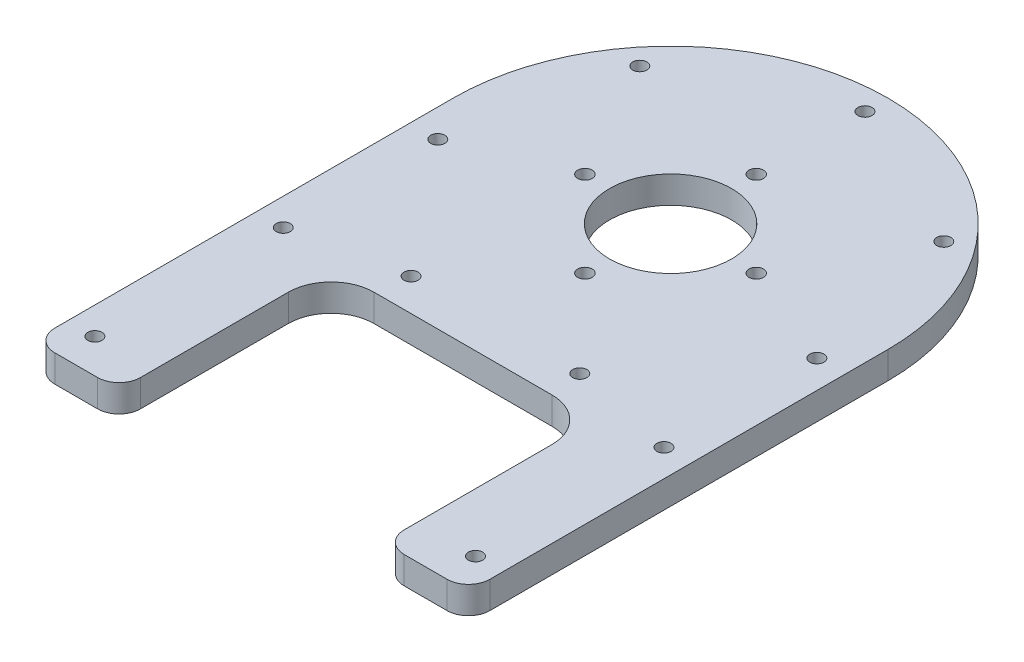
ISO-10303-21;
HEADER;
FILE_DESCRIPTION(('STEP AP214'),'2;1');
FILE_NAME('part.step','',(''),(''),'','','');
FILE_SCHEMA(('AUTOMOTIVE_DESIGN { 1 0 10303 214 1 1 1 1 }'));
ENDSEC;
DATA;
#1=APPLICATION_CONTEXT('core data for automotive mechanical design processes');
#2=APPLICATION_PROTOCOL_DEFINITION('international standard','automotive_design',2000,#1);
#3=PRODUCT_CONTEXT('',#1,'mechanical');
#4=PRODUCT('Part','Part','',(#3));
#5=PRODUCT_RELATED_PRODUCT_CATEGORY('part','',(#4));
#6=PRODUCT_DEFINITION_FORMATION('','',#4);
#7=PRODUCT_DEFINITION_CONTEXT('part definition',#1,'design');
#8=PRODUCT_DEFINITION('design','',#6,#7);
#9=PRODUCT_DEFINITION_SHAPE('','',#8);
#10=(LENGTH_UNIT() NAMED_UNIT(*) SI_UNIT(.MILLI.,.METRE.));
#11=(NAMED_UNIT(*) PLANE_ANGLE_UNIT() SI_UNIT($,.RADIAN.));
#12=(NAMED_UNIT(*) SI_UNIT($,.STERADIAN.) SOLID_ANGLE_UNIT());
#13=UNCERTAINTY_MEASURE_WITH_UNIT(LENGTH_MEASURE(1.E-05),#10,'distance_accuracy_value','');
#14=(GEOMETRIC_REPRESENTATION_CONTEXT(3) GLOBAL_UNCERTAINTY_ASSIGNED_CONTEXT((#13)) GLOBAL_UNIT_ASSIGNED_CONTEXT((#10,
#11,#12)) REPRESENTATION_CONTEXT('',''));
#15=CARTESIAN_POINT('',(0.,0.,0.));
#16=DIRECTION('',(0.,0.,1.));
#17=DIRECTION('',(1.,0.,0.));
#18=AXIS2_PLACEMENT_3D('',#15,#16,#17);
#19=CARTESIAN_POINT('',(50.8,6.35,0.));
#20=DIRECTION('',(-1.,0.,0.));
#21=DIRECTION('',(0.,0.,1.));
#22=AXIS2_PLACEMENT_3D('',#19,#20,#21);
#23=PLANE('',#22);
#24=DIRECTION('',(0.,0.,-1.));
#25=VECTOR('',#24,1.);
#26=CARTESIAN_POINT('',(50.8,6.35,0.));
#27=LINE('',#26,#25);
#28=CARTESIAN_POINT('',(50.8,6.35,93.));
#29=VERTEX_POINT('',#28);
#30=CARTESIAN_POINT('',(50.8,6.35,0.));
#31=VERTEX_POINT('',#30);
#32=EDGE_CURVE('E146',#29,#31,#27,.T.);
#33=ORIENTED_EDGE('',*,*,#32,.F.);
#34=DIRECTION('',(0.,-1.,0.));
#35=VECTOR('',#34,1.);
#36=CARTESIAN_POINT('',(50.8,6.35,93.));
#37=LINE('',#36,#35);
#38=CARTESIAN_POINT('',(50.8,0.,93.));
#39=VERTEX_POINT('',#38);
#40=EDGE_CURVE('E198',#29,#39,#37,.T.);
#41=ORIENTED_EDGE('',*,*,#40,.T.);
#42=DIRECTION('',(0.,0.,-1.));
#43=VECTOR('',#42,1.);
#44=CARTESIAN_POINT('',(50.8,0.,0.));
#45=LINE('',#44,#43);
#46=CARTESIAN_POINT('',(50.8,0.,0.));
#47=VERTEX_POINT('',#46);
#48=EDGE_CURVE('E171',#39,#47,#45,.T.);
#49=ORIENTED_EDGE('',*,*,#48,.T.);
#50=DIRECTION('',(0.,-1.,0.));
#51=VECTOR('',#50,1.);
#52=CARTESIAN_POINT('',(50.8,6.35,0.));
#53=LINE('',#52,#51);
#54=EDGE_CURVE('E164',#31,#47,#53,.T.);
#55=ORIENTED_EDGE('',*,*,#54,.F.);
#56=EDGE_LOOP('',(#33,#41,#49,#55));
#57=FACE_BOUND('',#56,.T.);
#58=ADVANCED_FACE('F45',(#57),#23,.F.);
#59=CARTESIAN_POINT('',(0.,6.35,0.));
#60=DIRECTION('',(0.,-1.,0.));
#61=DIRECTION('',(0.,0.,-1.));
#62=AXIS2_PLACEMENT_3D('',#59,#60,#61);
#63=CYLINDRICAL_SURFACE('',#62,50.8);
#64=CARTESIAN_POINT('',(0.,0.,0.));
#65=DIRECTION('',(0.,1.,0.));
#66=DIRECTION('',(0.,0.,1.));
#67=AXIS2_PLACEMENT_3D('',#64,#65,#66);
#68=CIRCLE('',#67,50.8);
#69=CARTESIAN_POINT('',(-50.8,0.,0.));
#70=VERTEX_POINT('',#69);
#71=EDGE_CURVE('E267',#47,#70,#68,.T.);
#72=ORIENTED_EDGE('',*,*,#71,.T.);
#73=DIRECTION('',(0.,-1.,0.));
#74=VECTOR('',#73,1.);
#75=CARTESIAN_POINT('',(-50.8,6.35,0.));
#76=LINE('',#75,#74);
#77=CARTESIAN_POINT('',(-50.8,6.35,0.));
#78=VERTEX_POINT('',#77);
#79=EDGE_CURVE('E166',#78,#70,#76,.T.);
#80=ORIENTED_EDGE('',*,*,#79,.F.);
#81=CARTESIAN_POINT('',(0.,6.35,0.));
#82=DIRECTION('',(0.,1.,0.));
#83=DIRECTION('',(0.,0.,1.));
#84=AXIS2_PLACEMENT_3D('',#81,#82,#83);
#85=CIRCLE('',#84,50.8);
#86=EDGE_CURVE('E151',#31,#78,#85,.T.);
#87=ORIENTED_EDGE('',*,*,#86,.F.);
#88=ORIENTED_EDGE('',*,*,#54,.T.);
#89=EDGE_LOOP('',(#72,#80,#87,#88));
#90=FACE_BOUND('',#89,.T.);
#91=ADVANCED_FACE('F163',(#90),#63,.T.);
#92=CARTESIAN_POINT('',(-50.8,6.35,0.));
#93=DIRECTION('',(1.,0.,0.));
#94=DIRECTION('',(0.,0.,-1.));
#95=AXIS2_PLACEMENT_3D('',#92,#93,#94);
#96=PLANE('',#95);
#97=DIRECTION('',(0.,0.,1.));
#98=VECTOR('',#97,1.);
#99=CARTESIAN_POINT('',(-50.8,0.,0.));
#100=LINE('',#99,#98);
#101=CARTESIAN_POINT('',(-50.8,0.,93.));
#102=VERTEX_POINT('',#101);
#103=EDGE_CURVE('E253',#70,#102,#100,.T.);
#104=ORIENTED_EDGE('',*,*,#103,.T.);
#105=DIRECTION('',(0.,-1.,0.));
#106=VECTOR('',#105,1.);
#107=CARTESIAN_POINT('',(-50.8,6.35,93.));
#108=LINE('',#107,#106);
#109=CARTESIAN_POINT('',(-50.8,6.35,93.));
#110=VERTEX_POINT('',#109);
#111=EDGE_CURVE('E11',#102,#110,#108,.F.);
#112=ORIENTED_EDGE('',*,*,#111,.T.);
#113=DIRECTION('',(0.,0.,1.));
#114=VECTOR('',#113,1.);
#115=CARTESIAN_POINT('',(-50.8,6.35,0.));
#116=LINE('',#115,#114);
#117=EDGE_CURVE('E168',#78,#110,#116,.T.);
#118=ORIENTED_EDGE('',*,*,#117,.F.);
#119=ORIENTED_EDGE('',*,*,#79,.T.);
#120=EDGE_LOOP('',(#104,#112,#118,#119));
#121=FACE_BOUND('',#120,.T.);
#122=ADVANCED_FACE('F279',(#121),#96,.F.);
#123=CARTESIAN_POINT('',(0.,6.35,98.));
#124=DIRECTION('',(0.,0.,-1.));
#125=DIRECTION('',(-1.,0.,0.));
#126=AXIS2_PLACEMENT_3D('',#123,#124,#125);
#127=PLANE('',#126);
#128=DIRECTION('',(1.,0.,0.));
#129=VECTOR('',#128,1.);
#130=CARTESIAN_POINT('',(0.,0.,98.));
#131=LINE('',#130,#129);
#132=CARTESIAN_POINT('',(-45.8,0.,98.));
#133=VERTEX_POINT('',#132);
#134=CARTESIAN_POINT('',(-35.8,0.,98.));
#135=VERTEX_POINT('',#134);
#136=EDGE_CURVE('E233',#133,#135,#131,.T.);
#137=ORIENTED_EDGE('',*,*,#136,.T.);
#138=DIRECTION('',(0.,-1.,0.));
#139=VECTOR('',#138,1.);
#140=CARTESIAN_POINT('',(-35.8,6.35,98.));
#141=LINE('',#140,#139);
#142=CARTESIAN_POINT('',(-35.8,6.35,98.));
#143=VERTEX_POINT('',#142);
#144=EDGE_CURVE('E53',#135,#143,#141,.F.);
#145=ORIENTED_EDGE('',*,*,#144,.T.);
#146=DIRECTION('',(1.,0.,0.));
#147=VECTOR('',#146,1.);
#148=CARTESIAN_POINT('',(0.,6.35,98.));
#149=LINE('',#148,#147);
#150=CARTESIAN_POINT('',(-45.8,6.35,98.));
#151=VERTEX_POINT('',#150);
#152=EDGE_CURVE('E230',#151,#143,#149,.T.);
#153=ORIENTED_EDGE('',*,*,#152,.F.);
#154=DIRECTION('',(0.,-1.,0.));
#155=VECTOR('',#154,1.);
#156=CARTESIAN_POINT('',(-45.8,6.35,98.));
#157=LINE('',#156,#155);
#158=EDGE_CURVE('E223',#151,#133,#157,.T.);
#159=ORIENTED_EDGE('',*,*,#158,.T.);
#160=EDGE_LOOP('',(#137,#145,#153,#159));
#161=FACE_BOUND('',#160,.T.);
#162=ADVANCED_FACE('F229',(#161),#127,.F.);
#163=CARTESIAN_POINT('',(-30.8,6.35,0.));
#164=DIRECTION('',(-1.,0.,0.));
#165=DIRECTION('',(0.,0.,1.));
#166=AXIS2_PLACEMENT_3D('',#163,#164,#165);
#167=PLANE('',#166);
#168=DIRECTION('',(0.,0.,-1.));
#169=VECTOR('',#168,1.);
#170=CARTESIAN_POINT('',(-30.8,6.35,0.));
#171=LINE('',#170,#169);
#172=CARTESIAN_POINT('',(-30.8,6.35,93.));
#173=VERTEX_POINT('',#172);
#174=CARTESIAN_POINT('',(-30.8,6.35,58.47));
#175=VERTEX_POINT('',#174);
#176=EDGE_CURVE('E236',#173,#175,#171,.T.);
#177=ORIENTED_EDGE('',*,*,#176,.F.);
#178=DIRECTION('',(0.,-1.,0.));
#179=VECTOR('',#178,1.);
#180=CARTESIAN_POINT('',(-30.8,6.35,93.));
#181=LINE('',#180,#179);
#182=CARTESIAN_POINT('',(-30.8,0.,93.));
#183=VERTEX_POINT('',#182);
#184=EDGE_CURVE('E220',#173,#183,#181,.T.);
#185=ORIENTED_EDGE('',*,*,#184,.T.);
#186=DIRECTION('',(0.,0.,-1.));
#187=VECTOR('',#186,1.);
#188=CARTESIAN_POINT('',(-30.8,0.,0.));
#189=LINE('',#188,#187);
#190=CARTESIAN_POINT('',(-30.8,0.,58.47));
#191=VERTEX_POINT('',#190);
#192=EDGE_CURVE('E243',#183,#191,#189,.T.);
#193=ORIENTED_EDGE('',*,*,#192,.T.);
#194=DIRECTION('',(0.,-1.,0.));
#195=VECTOR('',#194,1.);
#196=CARTESIAN_POINT('',(-30.8,6.35,58.47));
#197=LINE('',#196,#195);
#198=EDGE_CURVE('E186',#191,#175,#197,.F.);
#199=ORIENTED_EDGE('',*,*,#198,.T.);
#200=EDGE_LOOP('',(#177,#185,#193,#199));
#201=FACE_BOUND('',#200,.T.);
#202=ADVANCED_FACE('F242',(#201),#167,.F.);
#203=CARTESIAN_POINT('',(0.,6.35,48.47));
#204=DIRECTION('',(0.,0.,-1.));
#205=DIRECTION('',(-1.,0.,0.));
#206=AXIS2_PLACEMENT_3D('',#203,#204,#205);
#207=PLANE('',#206);
#208=DIRECTION('',(1.,0.,0.));
#209=VECTOR('',#208,1.);
#210=CARTESIAN_POINT('',(0.,0.,48.47));
#211=LINE('',#210,#209);
#212=CARTESIAN_POINT('',(-20.8,0.,48.47));
#213=VERTEX_POINT('',#212);
#214=CARTESIAN_POINT('',(20.8,0.,48.47));
#215=VERTEX_POINT('',#214);
#216=EDGE_CURVE('E248',#213,#215,#211,.T.);
#217=ORIENTED_EDGE('',*,*,#216,.T.);
#218=DIRECTION('',(0.,-1.,0.));
#219=VECTOR('',#218,1.);
#220=CARTESIAN_POINT('',(20.8,6.35,48.47));
#221=LINE('',#220,#219);
#222=CARTESIAN_POINT('',(20.8,6.35,48.47));
#223=VERTEX_POINT('',#222);
#224=EDGE_CURVE('E184',#215,#223,#221,.F.);
#225=ORIENTED_EDGE('',*,*,#224,.T.);
#226=DIRECTION('',(1.,0.,0.));
#227=VECTOR('',#226,1.);
#228=CARTESIAN_POINT('',(0.,6.35,48.47));
#229=LINE('',#228,#227);
#230=CARTESIAN_POINT('',(-20.8,6.35,48.47));
#231=VERTEX_POINT('',#230);
#232=EDGE_CURVE('E319',#231,#223,#229,.T.);
#233=ORIENTED_EDGE('',*,*,#232,.F.);
#234=DIRECTION('',(0.,-1.,0.));
#235=VECTOR('',#234,1.);
#236=CARTESIAN_POINT('',(-20.8,0.,48.47));
#237=LINE('',#236,#235);
#238=EDGE_CURVE('E176',#231,#213,#237,.T.);
#239=ORIENTED_EDGE('',*,*,#238,.T.);
#240=EDGE_LOOP('',(#217,#225,#233,#239));
#241=FACE_BOUND('',#240,.T.);
#242=ADVANCED_FACE('F475',(#241),#207,.F.);
#243=CARTESIAN_POINT('',(30.8,6.35,0.));
#244=DIRECTION('',(1.,0.,0.));
#245=DIRECTION('',(0.,0.,-1.));
#246=AXIS2_PLACEMENT_3D('',#243,#244,#245);
#247=PLANE('',#246);
#248=DIRECTION('',(0.,0.,1.));
#249=VECTOR('',#248,1.);
#250=CARTESIAN_POINT('',(30.8,0.,0.));
#251=LINE('',#250,#249);
#252=CARTESIAN_POINT('',(30.8,0.,58.47));
#253=VERTEX_POINT('',#252);
#254=CARTESIAN_POINT('',(30.8,0.,93.));
#255=VERTEX_POINT('',#254);
#256=EDGE_CURVE('E251',#253,#255,#251,.T.);
#257=ORIENTED_EDGE('',*,*,#256,.T.);
#258=DIRECTION('',(0.,-1.,0.));
#259=VECTOR('',#258,1.);
#260=CARTESIAN_POINT('',(30.8,6.35,93.));
#261=LINE('',#260,#259);
#262=CARTESIAN_POINT('',(30.8,6.35,93.));
#263=VERTEX_POINT('',#262);
#264=EDGE_CURVE('E60',#255,#263,#261,.F.);
#265=ORIENTED_EDGE('',*,*,#264,.T.);
#266=DIRECTION('',(0.,0.,1.));
#267=VECTOR('',#266,1.);
#268=CARTESIAN_POINT('',(30.8,6.35,0.));
#269=LINE('',#268,#267);
#270=CARTESIAN_POINT('',(30.8,6.35,58.47));
#271=VERTEX_POINT('',#270);
#272=EDGE_CURVE('E318',#271,#263,#269,.T.);
#273=ORIENTED_EDGE('',*,*,#272,.F.);
#274=DIRECTION('',(0.,-1.,0.));
#275=VECTOR('',#274,1.);
#276=CARTESIAN_POINT('',(30.8,0.,58.47));
#277=LINE('',#276,#275);
#278=EDGE_CURVE('E173',#271,#253,#277,.T.);
#279=ORIENTED_EDGE('',*,*,#278,.T.);
#280=EDGE_LOOP('',(#257,#265,#273,#279));
#281=FACE_BOUND('',#280,.T.);
#282=ADVANCED_FACE('F472',(#281),#247,.F.);
#283=CARTESIAN_POINT('',(0.,6.35,98.));
#284=DIRECTION('',(0.,0.,-1.));
#285=DIRECTION('',(-1.,0.,0.));
#286=AXIS2_PLACEMENT_3D('',#283,#284,#285);
#287=PLANE('',#286);
#288=DIRECTION('',(1.,0.,0.));
#289=VECTOR('',#288,1.);
#290=CARTESIAN_POINT('',(0.,0.,98.));
#291=LINE('',#290,#289);
#292=CARTESIAN_POINT('',(35.8,0.,98.));
#293=VERTEX_POINT('',#292);
#294=CARTESIAN_POINT('',(45.8,0.,98.));
#295=VERTEX_POINT('',#294);
#296=EDGE_CURVE('E159',#293,#295,#291,.T.);
#297=ORIENTED_EDGE('',*,*,#296,.T.);
#298=DIRECTION('',(0.,-1.,0.));
#299=VECTOR('',#298,1.);
#300=CARTESIAN_POINT('',(45.8,6.35,98.));
#301=LINE('',#300,#299);
#302=CARTESIAN_POINT('',(45.8,6.35,98.));
#303=VERTEX_POINT('',#302);
#304=EDGE_CURVE('E211',#295,#303,#301,.F.);
#305=ORIENTED_EDGE('',*,*,#304,.T.);
#306=DIRECTION('',(1.,0.,0.));
#307=VECTOR('',#306,1.);
#308=CARTESIAN_POINT('',(0.,6.35,98.));
#309=LINE('',#308,#307);
#310=CARTESIAN_POINT('',(35.8,6.35,98.));
#311=VERTEX_POINT('',#310);
#312=EDGE_CURVE('E178',#311,#303,#309,.T.);
#313=ORIENTED_EDGE('',*,*,#312,.F.);
#314=DIRECTION('',(0.,-1.,0.));
#315=VECTOR('',#314,1.);
#316=CARTESIAN_POINT('',(35.8,6.35,98.));
#317=LINE('',#316,#315);
#318=EDGE_CURVE('E208',#311,#293,#317,.T.);
#319=ORIENTED_EDGE('',*,*,#318,.T.);
#320=EDGE_LOOP('',(#297,#305,#313,#319));
#321=FACE_BOUND('',#320,.T.);
#322=ADVANCED_FACE('F261',(#321),#287,.F.);
#323=CARTESIAN_POINT('',(0.,6.35,0.));
#324=DIRECTION('',(0.,1.,0.));
#325=DIRECTION('',(0.,0.,1.));
#326=AXIS2_PLACEMENT_3D('',#323,#324,#325);
#327=PLANE('',#326);
#328=CARTESIAN_POINT('',(0.,6.35,20.));
#329=DIRECTION('',(0.,1.,0.));
#330=DIRECTION('',(0.,0.,1.));
#331=AXIS2_PLACEMENT_3D('',#328,#329,#330);
#332=CIRCLE('',#331,1.7);
#333=CARTESIAN_POINT('',(0.,6.35,21.7));
#334=VERTEX_POINT('',#333);
#335=EDGE_CURVE('E414',#334,#334,#332,.T.);
#336=ORIENTED_EDGE('',*,*,#335,.F.);
#337=EDGE_LOOP('',(#336));
#338=FACE_BOUND('',#337,.T.);
#339=CARTESIAN_POINT('',(0.,6.35,-20.));
#340=DIRECTION('',(0.,1.,0.));
#341=DIRECTION('',(0.,0.,1.));
#342=AXIS2_PLACEMENT_3D('',#339,#340,#341);
#343=CIRCLE('',#342,1.7);
#344=CARTESIAN_POINT('',(0.,6.35,-18.3));
#345=VERTEX_POINT('',#344);
#346=EDGE_CURVE('E408',#345,#345,#343,.T.);
#347=ORIENTED_EDGE('',*,*,#346,.F.);
#348=EDGE_LOOP('',(#347));
#349=FACE_BOUND('',#348,.T.);
#350=CARTESIAN_POINT('',(20.,6.35,0.));
#351=DIRECTION('',(0.,1.,0.));
#352=DIRECTION('',(0.,0.,1.));
#353=AXIS2_PLACEMENT_3D('',#350,#351,#352);
#354=CIRCLE('',#353,1.7);
#355=CARTESIAN_POINT('',(20.,6.35,1.7));
#356=VERTEX_POINT('',#355);
#357=EDGE_CURVE('E402',#356,#356,#354,.T.);
#358=ORIENTED_EDGE('',*,*,#357,.F.);
#359=EDGE_LOOP('',(#358));
#360=FACE_BOUND('',#359,.T.);
#361=CARTESIAN_POINT('',(-20.,6.35,0.));
#362=DIRECTION('',(0.,1.,0.));
#363=DIRECTION('',(0.,0.,1.));
#364=AXIS2_PLACEMENT_3D('',#361,#362,#363);
#365=CIRCLE('',#364,1.7);
#366=CARTESIAN_POINT('',(-20.,6.35,1.7));
#367=VERTEX_POINT('',#366);
#368=EDGE_CURVE('E396',#367,#367,#365,.T.);
#369=ORIENTED_EDGE('',*,*,#368,.F.);
#370=EDGE_LOOP('',(#369));
#371=FACE_BOUND('',#370,.T.);
#372=CARTESIAN_POINT('',(0.,6.35,0.));
#373=DIRECTION('',(0.,1.,0.));
#374=DIRECTION('',(0.,0.,1.));
#375=AXIS2_PLACEMENT_3D('',#372,#373,#374);
#376=CIRCLE('',#375,14.25);
#377=CARTESIAN_POINT('',(0.,6.35,14.25));
#378=VERTEX_POINT('',#377);
#379=EDGE_CURVE('E387',#378,#378,#376,.T.);
#380=ORIENTED_EDGE('',*,*,#379,.F.);
#381=EDGE_LOOP('',(#380));
#382=FACE_BOUND('',#381,.T.);
#383=CARTESIAN_POINT('',(-19.6983217559339,6.35,40.9039866027706));
#384=DIRECTION('',(0.,1.,0.));
#385=DIRECTION('',(0.,0.,1.));
#386=AXIS2_PLACEMENT_3D('',#383,#384,#385);
#387=CIRCLE('',#386,1.64999999999999);
#388=CARTESIAN_POINT('',(-19.6983217559339,6.35,42.5539866027706));
#389=VERTEX_POINT('',#388);
#390=EDGE_CURVE('E384',#389,#389,#387,.T.);
#391=ORIENTED_EDGE('',*,*,#390,.F.);
#392=EDGE_LOOP('',(#391));
#393=FACE_BOUND('',#392,.T.);
#394=CARTESIAN_POINT('',(19.6983217559404,6.35,40.9039866027691));
#395=DIRECTION('',(0.,1.,0.));
#396=DIRECTION('',(0.,0.,1.));
#397=AXIS2_PLACEMENT_3D('',#394,#395,#396);
#398=CIRCLE('',#397,1.64999999999999);
#399=CARTESIAN_POINT('',(19.6983217559404,6.35,42.5539866027691));
#400=VERTEX_POINT('',#399);
#401=EDGE_CURVE('E378',#400,#400,#398,.T.);
#402=ORIENTED_EDGE('',*,*,#401,.F.);
#403=EDGE_LOOP('',(#402));
#404=FACE_BOUND('',#403,.T.);
#405=CARTESIAN_POINT('',(-44.2617272130527,6.35,10.1024504016183));
#406=DIRECTION('',(0.,1.,0.));
#407=DIRECTION('',(0.,0.,1.));
#408=AXIS2_PLACEMENT_3D('',#405,#406,#407);
#409=CIRCLE('',#408,1.64999999999998);
#410=CARTESIAN_POINT('',(-44.2617272130527,6.35,11.7524504016183));
#411=VERTEX_POINT('',#410);
#412=EDGE_CURVE('E372',#411,#411,#409,.T.);
#413=ORIENTED_EDGE('',*,*,#412,.F.);
#414=EDGE_LOOP('',(#413));
#415=FACE_BOUND('',#414,.T.);
#416=CARTESIAN_POINT('',(-35.4951493040479,6.35,-28.3064370043852));
#417=DIRECTION('',(0.,1.,0.));
#418=DIRECTION('',(0.,0.,1.));
#419=AXIS2_PLACEMENT_3D('',#416,#417,#418);
#420=CIRCLE('',#419,1.64999999999998);
#421=CARTESIAN_POINT('',(-35.4951493040479,6.35,-26.6564370043852));
#422=VERTEX_POINT('',#421);
#423=EDGE_CURVE('E366',#422,#422,#420,.T.);
#424=ORIENTED_EDGE('',*,*,#423,.F.);
#425=EDGE_LOOP('',(#424));
#426=FACE_BOUND('',#425,.T.);
#427=CARTESIAN_POINT('',(0.,6.35,-45.4));
#428=DIRECTION('',(0.,1.,0.));
#429=DIRECTION('',(0.,0.,1.));
#430=AXIS2_PLACEMENT_3D('',#427,#428,#429);
#431=CIRCLE('',#430,1.64999999999999);
#432=CARTESIAN_POINT('',(0.,6.35,-43.75));
#433=VERTEX_POINT('',#432);
#434=EDGE_CURVE('E360',#433,#433,#431,.T.);
#435=ORIENTED_EDGE('',*,*,#434,.F.);
#436=EDGE_LOOP('',(#435));
#437=FACE_BOUND('',#436,.T.);
#438=CARTESIAN_POINT('',(35.4951493040492,6.35,-28.3064370043878));
#439=DIRECTION('',(0.,1.,0.));
#440=DIRECTION('',(0.,0.,1.));
#441=AXIS2_PLACEMENT_3D('',#438,#439,#440);
#442=CIRCLE('',#441,1.64999999999998);
#443=CARTESIAN_POINT('',(35.4951493040492,6.35,-26.6564370043878));
#444=VERTEX_POINT('',#443);
#445=EDGE_CURVE('E354',#444,#444,#442,.T.);
#446=ORIENTED_EDGE('',*,*,#445,.F.);
#447=EDGE_LOOP('',(#446));
#448=FACE_BOUND('',#447,.T.);
#449=CARTESIAN_POINT('',(44.2617272130569,6.35,10.102450401615));
#450=DIRECTION('',(0.,1.,0.));
#451=DIRECTION('',(0.,0.,1.));
#452=AXIS2_PLACEMENT_3D('',#449,#450,#451);
#453=CIRCLE('',#452,1.64999999999998);
#454=CARTESIAN_POINT('',(44.2617272130569,6.35,11.752450401615));
#455=VERTEX_POINT('',#454);
#456=EDGE_CURVE('E348',#455,#455,#453,.T.);
#457=ORIENTED_EDGE('',*,*,#456,.F.);
#458=EDGE_LOOP('',(#457));
#459=FACE_BOUND('',#458,.T.);
#460=CARTESIAN_POINT('',(-44.45,6.35,90.));
#461=DIRECTION('',(0.,1.,0.));
#462=DIRECTION('',(0.,0.,1.));
#463=AXIS2_PLACEMENT_3D('',#460,#461,#462);
#464=CIRCLE('',#463,1.64999999999999);
#465=CARTESIAN_POINT('',(-44.45,6.35,91.65));
#466=VERTEX_POINT('',#465);
#467=EDGE_CURVE('E342',#466,#466,#464,.T.);
#468=ORIENTED_EDGE('',*,*,#467,.F.);
#469=EDGE_LOOP('',(#468));
#470=FACE_BOUND('',#469,.T.);
#471=CARTESIAN_POINT('',(44.45,6.35,90.));
#472=DIRECTION('',(0.,1.,0.));
#473=DIRECTION('',(0.,0.,1.));
#474=AXIS2_PLACEMENT_3D('',#471,#472,#473);
#475=CIRCLE('',#474,1.64999999999999);
#476=CARTESIAN_POINT('',(44.45,6.35,91.65));
#477=VERTEX_POINT('',#476);
#478=EDGE_CURVE('E336',#477,#477,#475,.T.);
#479=ORIENTED_EDGE('',*,*,#478,.F.);
#480=EDGE_LOOP('',(#479));
#481=FACE_BOUND('',#480,.T.);
#482=CARTESIAN_POINT('',(44.45,6.35,46.));
#483=DIRECTION('',(0.,1.,0.));
#484=DIRECTION('',(0.,0.,1.));
#485=AXIS2_PLACEMENT_3D('',#482,#483,#484);
#486=CIRCLE('',#485,1.64999999999999);
#487=CARTESIAN_POINT('',(44.45,6.35,47.65));
#488=VERTEX_POINT('',#487);
#489=EDGE_CURVE('E330',#488,#488,#486,.T.);
#490=ORIENTED_EDGE('',*,*,#489,.F.);
#491=EDGE_LOOP('',(#490));
#492=FACE_BOUND('',#491,.T.);
#493=CARTESIAN_POINT('',(-44.45,6.35,46.));
#494=DIRECTION('',(0.,1.,0.));
#495=DIRECTION('',(0.,0.,1.));
#496=AXIS2_PLACEMENT_3D('',#493,#494,#495);
#497=CIRCLE('',#496,1.64999999999999);
#498=CARTESIAN_POINT('',(-44.45,6.35,47.65));
#499=VERTEX_POINT('',#498);
#500=EDGE_CURVE('E272',#499,#499,#497,.T.);
#501=ORIENTED_EDGE('',*,*,#500,.F.);
#502=EDGE_LOOP('',(#501));
#503=FACE_BOUND('',#502,.T.);
#504=ORIENTED_EDGE('',*,*,#312,.T.);
#505=CARTESIAN_POINT('',(45.8,6.35,93.));
#506=DIRECTION('',(0.,1.,0.));
#507=DIRECTION('',(0.,0.,1.));
#508=AXIS2_PLACEMENT_3D('',#505,#506,#507);
#509=CIRCLE('',#508,5.);
#510=EDGE_CURVE('E154',#303,#29,#509,.T.);
#511=ORIENTED_EDGE('',*,*,#510,.T.);
#512=ORIENTED_EDGE('',*,*,#32,.T.);
#513=ORIENTED_EDGE('',*,*,#86,.T.);
#514=ORIENTED_EDGE('',*,*,#117,.T.);
#515=CARTESIAN_POINT('',(-45.8,6.35,93.));
#516=DIRECTION('',(0.,1.,0.));
#517=DIRECTION('',(0.,0.,1.));
#518=AXIS2_PLACEMENT_3D('',#515,#516,#517);
#519=CIRCLE('',#518,5.);
#520=EDGE_CURVE('E213',#110,#151,#519,.T.);
#521=ORIENTED_EDGE('',*,*,#520,.T.);
#522=ORIENTED_EDGE('',*,*,#152,.T.);
#523=CARTESIAN_POINT('',(-35.8,6.35,93.));
#524=DIRECTION('',(0.,1.,0.));
#525=DIRECTION('',(0.,0.,1.));
#526=AXIS2_PLACEMENT_3D('',#523,#524,#525);
#527=CIRCLE('',#526,5.);
#528=EDGE_CURVE('E68',#143,#173,#527,.T.);
#529=ORIENTED_EDGE('',*,*,#528,.T.);
#530=ORIENTED_EDGE('',*,*,#176,.T.);
#531=CARTESIAN_POINT('',(-20.8,6.35,58.47));
#532=DIRECTION('',(0.,1.,0.));
#533=DIRECTION('',(0.,0.,1.));
#534=AXIS2_PLACEMENT_3D('',#531,#532,#533);
#535=CIRCLE('',#534,10.);
#536=EDGE_CURVE('E196',#175,#231,#535,.F.);
#537=ORIENTED_EDGE('',*,*,#536,.T.);
#538=ORIENTED_EDGE('',*,*,#232,.T.);
#539=CARTESIAN_POINT('',(20.8,6.35,58.47));
#540=DIRECTION('',(0.,1.,0.));
#541=DIRECTION('',(0.,0.,1.));
#542=AXIS2_PLACEMENT_3D('',#539,#540,#541);
#543=CIRCLE('',#542,10.);
#544=EDGE_CURVE('E191',#223,#271,#543,.F.);
#545=ORIENTED_EDGE('',*,*,#544,.T.);
#546=ORIENTED_EDGE('',*,*,#272,.T.);
#547=CARTESIAN_POINT('',(35.8,6.35,93.));
#548=DIRECTION('',(0.,1.,0.));
#549=DIRECTION('',(0.,0.,1.));
#550=AXIS2_PLACEMENT_3D('',#547,#548,#549);
#551=CIRCLE('',#550,5.);
#552=EDGE_CURVE('E216',#263,#311,#551,.T.);
#553=ORIENTED_EDGE('',*,*,#552,.T.);
#554=EDGE_LOOP('',(#504,#511,#512,#513,#514,#521,#522,#529,#530,#537,#538,#545,#546,#553));
#555=FACE_BOUND('',#554,.T.);
#556=ADVANCED_FACE('F149',(#338,#349,#360,#371,#382,#393,#404,#415,#426,#437,#448,#459,#470,
#481,#492,#503,#555),#327,.T.);
#557=CARTESIAN_POINT('',(0.,0.,0.));
#558=DIRECTION('',(0.,1.,0.));
#559=DIRECTION('',(0.,0.,1.));
#560=AXIS2_PLACEMENT_3D('',#557,#558,#559);
#561=PLANE('',#560);
#562=CARTESIAN_POINT('',(0.,0.,20.));
#563=DIRECTION('',(0.,1.,0.));
#564=DIRECTION('',(0.,0.,1.));
#565=AXIS2_PLACEMENT_3D('',#562,#563,#564);
#566=CIRCLE('',#565,1.7);
#567=CARTESIAN_POINT('',(0.,0.,21.7));
#568=VERTEX_POINT('',#567);
#569=EDGE_CURVE('E411',#568,#568,#566,.T.);
#570=ORIENTED_EDGE('',*,*,#569,.T.);
#571=EDGE_LOOP('',(#570));
#572=FACE_BOUND('',#571,.T.);
#573=CARTESIAN_POINT('',(0.,0.,-20.));
#574=DIRECTION('',(0.,1.,0.));
#575=DIRECTION('',(0.,0.,1.));
#576=AXIS2_PLACEMENT_3D('',#573,#574,#575);
#577=CIRCLE('',#576,1.7);
#578=CARTESIAN_POINT('',(0.,0.,-18.3));
#579=VERTEX_POINT('',#578);
#580=EDGE_CURVE('E405',#579,#579,#577,.T.);
#581=ORIENTED_EDGE('',*,*,#580,.T.);
#582=EDGE_LOOP('',(#581));
#583=FACE_BOUND('',#582,.T.);
#584=CARTESIAN_POINT('',(20.,0.,0.));
#585=DIRECTION('',(0.,1.,0.));
#586=DIRECTION('',(0.,0.,1.));
#587=AXIS2_PLACEMENT_3D('',#584,#585,#586);
#588=CIRCLE('',#587,1.7);
#589=CARTESIAN_POINT('',(20.,0.,1.7));
#590=VERTEX_POINT('',#589);
#591=EDGE_CURVE('E399',#590,#590,#588,.T.);
#592=ORIENTED_EDGE('',*,*,#591,.T.);
#593=EDGE_LOOP('',(#592));
#594=FACE_BOUND('',#593,.T.);
#595=CARTESIAN_POINT('',(-20.,0.,0.));
#596=DIRECTION('',(0.,1.,0.));
#597=DIRECTION('',(0.,0.,1.));
#598=AXIS2_PLACEMENT_3D('',#595,#596,#597);
#599=CIRCLE('',#598,1.7);
#600=CARTESIAN_POINT('',(-20.,0.,1.7));
#601=VERTEX_POINT('',#600);
#602=EDGE_CURVE('E393',#601,#601,#599,.T.);
#603=ORIENTED_EDGE('',*,*,#602,.T.);
#604=EDGE_LOOP('',(#603));
#605=FACE_BOUND('',#604,.T.);
#606=CARTESIAN_POINT('',(0.,0.,0.));
#607=DIRECTION('',(0.,1.,0.));
#608=DIRECTION('',(0.,0.,1.));
#609=AXIS2_PLACEMENT_3D('',#606,#607,#608);
#610=CIRCLE('',#609,14.25);
#611=CARTESIAN_POINT('',(0.,0.,14.25));
#612=VERTEX_POINT('',#611);
#613=EDGE_CURVE('E390',#612,#612,#610,.T.);
#614=ORIENTED_EDGE('',*,*,#613,.T.);
#615=EDGE_LOOP('',(#614));
#616=FACE_BOUND('',#615,.T.);
#617=CARTESIAN_POINT('',(-19.6983217559339,0.,40.9039866027706));
#618=DIRECTION('',(0.,1.,0.));
#619=DIRECTION('',(0.,0.,1.));
#620=AXIS2_PLACEMENT_3D('',#617,#618,#619);
#621=CIRCLE('',#620,1.65);
#622=CARTESIAN_POINT('',(-19.6983217559339,0.,42.5539866027706));
#623=VERTEX_POINT('',#622);
#624=EDGE_CURVE('E381',#623,#623,#621,.T.);
#625=ORIENTED_EDGE('',*,*,#624,.T.);
#626=EDGE_LOOP('',(#625));
#627=FACE_BOUND('',#626,.T.);
#628=CARTESIAN_POINT('',(19.6983217559404,0.,40.9039866027691));
#629=DIRECTION('',(0.,1.,0.));
#630=DIRECTION('',(0.,0.,1.));
#631=AXIS2_PLACEMENT_3D('',#628,#629,#630);
#632=CIRCLE('',#631,1.65);
#633=CARTESIAN_POINT('',(19.6983217559404,0.,42.5539866027691));
#634=VERTEX_POINT('',#633);
#635=EDGE_CURVE('E375',#634,#634,#632,.T.);
#636=ORIENTED_EDGE('',*,*,#635,.T.);
#637=EDGE_LOOP('',(#636));
#638=FACE_BOUND('',#637,.T.);
#639=CARTESIAN_POINT('',(-44.2617272130527,0.,10.1024504016183));
#640=DIRECTION('',(0.,1.,0.));
#641=DIRECTION('',(0.,0.,1.));
#642=AXIS2_PLACEMENT_3D('',#639,#640,#641);
#643=CIRCLE('',#642,1.65);
#644=CARTESIAN_POINT('',(-44.2617272130527,0.,11.7524504016183));
#645=VERTEX_POINT('',#644);
#646=EDGE_CURVE('E369',#645,#645,#643,.T.);
#647=ORIENTED_EDGE('',*,*,#646,.T.);
#648=EDGE_LOOP('',(#647));
#649=FACE_BOUND('',#648,.T.);
#650=CARTESIAN_POINT('',(-35.4951493040479,0.,-28.3064370043852));
#651=DIRECTION('',(0.,1.,0.));
#652=DIRECTION('',(0.,0.,1.));
#653=AXIS2_PLACEMENT_3D('',#650,#651,#652);
#654=CIRCLE('',#653,1.65);
#655=CARTESIAN_POINT('',(-35.4951493040479,0.,-26.6564370043852));
#656=VERTEX_POINT('',#655);
#657=EDGE_CURVE('E363',#656,#656,#654,.T.);
#658=ORIENTED_EDGE('',*,*,#657,.T.);
#659=EDGE_LOOP('',(#658));
#660=FACE_BOUND('',#659,.T.);
#661=CARTESIAN_POINT('',(0.,0.,-45.4));
#662=DIRECTION('',(0.,1.,0.));
#663=DIRECTION('',(0.,0.,1.));
#664=AXIS2_PLACEMENT_3D('',#661,#662,#663);
#665=CIRCLE('',#664,1.65);
#666=CARTESIAN_POINT('',(0.,0.,-43.75));
#667=VERTEX_POINT('',#666);
#668=EDGE_CURVE('E357',#667,#667,#665,.T.);
#669=ORIENTED_EDGE('',*,*,#668,.T.);
#670=EDGE_LOOP('',(#669));
#671=FACE_BOUND('',#670,.T.);
#672=CARTESIAN_POINT('',(35.4951493040492,0.,-28.3064370043878));
#673=DIRECTION('',(0.,1.,0.));
#674=DIRECTION('',(0.,0.,1.));
#675=AXIS2_PLACEMENT_3D('',#672,#673,#674);
#676=CIRCLE('',#675,1.65);
#677=CARTESIAN_POINT('',(35.4951493040492,0.,-26.6564370043878));
#678=VERTEX_POINT('',#677);
#679=EDGE_CURVE('E351',#678,#678,#676,.T.);
#680=ORIENTED_EDGE('',*,*,#679,.T.);
#681=EDGE_LOOP('',(#680));
#682=FACE_BOUND('',#681,.T.);
#683=CARTESIAN_POINT('',(44.2617272130569,0.,10.102450401615));
#684=DIRECTION('',(0.,1.,0.));
#685=DIRECTION('',(0.,0.,1.));
#686=AXIS2_PLACEMENT_3D('',#683,#684,#685);
#687=CIRCLE('',#686,1.65);
#688=CARTESIAN_POINT('',(44.2617272130569,0.,11.752450401615));
#689=VERTEX_POINT('',#688);
#690=EDGE_CURVE('E345',#689,#689,#687,.T.);
#691=ORIENTED_EDGE('',*,*,#690,.T.);
#692=EDGE_LOOP('',(#691));
#693=FACE_BOUND('',#692,.T.);
#694=CARTESIAN_POINT('',(-44.45,0.,90.));
#695=DIRECTION('',(0.,1.,0.));
#696=DIRECTION('',(0.,0.,1.));
#697=AXIS2_PLACEMENT_3D('',#694,#695,#696);
#698=CIRCLE('',#697,1.65);
#699=CARTESIAN_POINT('',(-44.45,0.,91.65));
#700=VERTEX_POINT('',#699);
#701=EDGE_CURVE('E339',#700,#700,#698,.T.);
#702=ORIENTED_EDGE('',*,*,#701,.T.);
#703=EDGE_LOOP('',(#702));
#704=FACE_BOUND('',#703,.T.);
#705=CARTESIAN_POINT('',(44.45,0.,90.));
#706=DIRECTION('',(0.,1.,0.));
#707=DIRECTION('',(0.,0.,1.));
#708=AXIS2_PLACEMENT_3D('',#705,#706,#707);
#709=CIRCLE('',#708,1.65);
#710=CARTESIAN_POINT('',(44.45,0.,91.65));
#711=VERTEX_POINT('',#710);
#712=EDGE_CURVE('E333',#711,#711,#709,.T.);
#713=ORIENTED_EDGE('',*,*,#712,.T.);
#714=EDGE_LOOP('',(#713));
#715=FACE_BOUND('',#714,.T.);
#716=CARTESIAN_POINT('',(44.45,0.,46.));
#717=DIRECTION('',(0.,1.,0.));
#718=DIRECTION('',(0.,0.,1.));
#719=AXIS2_PLACEMENT_3D('',#716,#717,#718);
#720=CIRCLE('',#719,1.65);
#721=CARTESIAN_POINT('',(44.45,0.,47.65));
#722=VERTEX_POINT('',#721);
#723=EDGE_CURVE('E327',#722,#722,#720,.T.);
#724=ORIENTED_EDGE('',*,*,#723,.T.);
#725=EDGE_LOOP('',(#724));
#726=FACE_BOUND('',#725,.T.);
#727=CARTESIAN_POINT('',(-44.45,0.,46.));
#728=DIRECTION('',(0.,1.,0.));
#729=DIRECTION('',(0.,0.,1.));
#730=AXIS2_PLACEMENT_3D('',#727,#728,#729);
#731=CIRCLE('',#730,1.65);
#732=CARTESIAN_POINT('',(-44.45,0.,47.65));
#733=VERTEX_POINT('',#732);
#734=EDGE_CURVE('E268',#733,#733,#731,.T.);
#735=ORIENTED_EDGE('',*,*,#734,.T.);
#736=EDGE_LOOP('',(#735));
#737=FACE_BOUND('',#736,.T.);
#738=ORIENTED_EDGE('',*,*,#48,.F.);
#739=CARTESIAN_POINT('',(45.8,0.,93.));
#740=DIRECTION('',(0.,1.,0.));
#741=DIRECTION('',(0.,0.,1.));
#742=AXIS2_PLACEMENT_3D('',#739,#740,#741);
#743=CIRCLE('',#742,5.);
#744=EDGE_CURVE('E206',#39,#295,#743,.F.);
#745=ORIENTED_EDGE('',*,*,#744,.T.);
#746=ORIENTED_EDGE('',*,*,#296,.F.);
#747=CARTESIAN_POINT('',(35.8,0.,93.));
#748=DIRECTION('',(0.,1.,0.));
#749=DIRECTION('',(0.,0.,1.));
#750=AXIS2_PLACEMENT_3D('',#747,#748,#749);
#751=CIRCLE('',#750,5.);
#752=EDGE_CURVE('E204',#293,#255,#751,.F.);
#753=ORIENTED_EDGE('',*,*,#752,.T.);
#754=ORIENTED_EDGE('',*,*,#256,.F.);
#755=CARTESIAN_POINT('',(20.8,0.,58.47));
#756=DIRECTION('',(0.,1.,0.));
#757=DIRECTION('',(0.,0.,1.));
#758=AXIS2_PLACEMENT_3D('',#755,#756,#757);
#759=CIRCLE('',#758,10.);
#760=EDGE_CURVE('E189',#253,#215,#759,.T.);
#761=ORIENTED_EDGE('',*,*,#760,.T.);
#762=ORIENTED_EDGE('',*,*,#216,.F.);
#763=CARTESIAN_POINT('',(-20.8,0.,58.47));
#764=DIRECTION('',(0.,1.,0.));
#765=DIRECTION('',(0.,0.,1.));
#766=AXIS2_PLACEMENT_3D('',#763,#764,#765);
#767=CIRCLE('',#766,10.);
#768=EDGE_CURVE('E193',#213,#191,#767,.T.);
#769=ORIENTED_EDGE('',*,*,#768,.T.);
#770=ORIENTED_EDGE('',*,*,#192,.F.);
#771=CARTESIAN_POINT('',(-35.8,0.,93.));
#772=DIRECTION('',(0.,1.,0.));
#773=DIRECTION('',(0.,0.,1.));
#774=AXIS2_PLACEMENT_3D('',#771,#772,#773);
#775=CIRCLE('',#774,5.);
#776=EDGE_CURVE('E202',#183,#135,#775,.F.);
#777=ORIENTED_EDGE('',*,*,#776,.T.);
#778=ORIENTED_EDGE('',*,*,#136,.F.);
#779=CARTESIAN_POINT('',(-45.8,0.,93.));
#780=DIRECTION('',(0.,1.,0.));
#781=DIRECTION('',(0.,0.,1.));
#782=AXIS2_PLACEMENT_3D('',#779,#780,#781);
#783=CIRCLE('',#782,5.);
#784=EDGE_CURVE('E200',#133,#102,#783,.F.);
#785=ORIENTED_EDGE('',*,*,#784,.T.);
#786=ORIENTED_EDGE('',*,*,#103,.F.);
#787=ORIENTED_EDGE('',*,*,#71,.F.);
#788=EDGE_LOOP('',(#738,#745,#746,#753,#754,#761,#762,#769,#770,#777,#778,#785,#786,#787));
#789=FACE_BOUND('',#788,.T.);
#790=ADVANCED_FACE('F245',(#572,#583,#594,#605,#616,#627,#638,#649,#660,#671,#682,#693,#704,
#715,#726,#737,#789),#561,.F.);
#791=CARTESIAN_POINT('',(20.8,6.35,58.47));
#792=DIRECTION('',(0.,1.,0.));
#793=DIRECTION('',(0.,0.,1.));
#794=AXIS2_PLACEMENT_3D('',#791,#792,#793);
#795=CYLINDRICAL_SURFACE('',#794,10.);
#796=ORIENTED_EDGE('',*,*,#544,.F.);
#797=ORIENTED_EDGE('',*,*,#224,.F.);
#798=ORIENTED_EDGE('',*,*,#760,.F.);
#799=ORIENTED_EDGE('',*,*,#278,.F.);
#800=EDGE_LOOP('',(#796,#797,#798,#799));
#801=FACE_BOUND('',#800,.T.);
#802=ADVANCED_FACE('F301',(#801),#795,.F.);
#803=CARTESIAN_POINT('',(-20.8,6.35,58.47));
#804=DIRECTION('',(0.,1.,0.));
#805=DIRECTION('',(0.,0.,1.));
#806=AXIS2_PLACEMENT_3D('',#803,#804,#805);
#807=CYLINDRICAL_SURFACE('',#806,10.);
#808=ORIENTED_EDGE('',*,*,#536,.F.);
#809=ORIENTED_EDGE('',*,*,#198,.F.);
#810=ORIENTED_EDGE('',*,*,#768,.F.);
#811=ORIENTED_EDGE('',*,*,#238,.F.);
#812=EDGE_LOOP('',(#808,#809,#810,#811));
#813=FACE_BOUND('',#812,.T.);
#814=ADVANCED_FACE('F304',(#813),#807,.F.);
#815=CARTESIAN_POINT('',(-44.45,6.35,46.));
#816=DIRECTION('',(0.,1.,0.));
#817=DIRECTION('',(0.,0.,1.));
#818=AXIS2_PLACEMENT_3D('',#815,#816,#817);
#819=CYLINDRICAL_SURFACE('',#818,1.65);
#820=ORIENTED_EDGE('',*,*,#734,.F.);
#821=EDGE_LOOP('',(#820));
#822=FACE_BOUND('',#821,.T.);
#823=ORIENTED_EDGE('',*,*,#500,.T.);
#824=EDGE_LOOP('',(#823));
#825=FACE_BOUND('',#824,.T.);
#826=ADVANCED_FACE('F308',(#822,#825),#819,.F.);
#827=CARTESIAN_POINT('',(44.45,6.35,46.));
#828=DIRECTION('',(0.,1.,0.));
#829=DIRECTION('',(0.,0.,1.));
#830=AXIS2_PLACEMENT_3D('',#827,#828,#829);
#831=CYLINDRICAL_SURFACE('',#830,1.65);
#832=ORIENTED_EDGE('',*,*,#723,.F.);
#833=EDGE_LOOP('',(#832));
#834=FACE_BOUND('',#833,.T.);
#835=ORIENTED_EDGE('',*,*,#489,.T.);
#836=EDGE_LOOP('',(#835));
#837=FACE_BOUND('',#836,.T.);
#838=ADVANCED_FACE('F454',(#834,#837),#831,.F.);
#839=CARTESIAN_POINT('',(44.45,6.35,90.));
#840=DIRECTION('',(0.,1.,0.));
#841=DIRECTION('',(0.,0.,1.));
#842=AXIS2_PLACEMENT_3D('',#839,#840,#841);
#843=CYLINDRICAL_SURFACE('',#842,1.65);
#844=ORIENTED_EDGE('',*,*,#712,.F.);
#845=EDGE_LOOP('',(#844));
#846=FACE_BOUND('',#845,.T.);
#847=ORIENTED_EDGE('',*,*,#478,.T.);
#848=EDGE_LOOP('',(#847));
#849=FACE_BOUND('',#848,.T.);
#850=ADVANCED_FACE('F461',(#846,#849),#843,.F.);
#851=CARTESIAN_POINT('',(-44.45,6.35,90.));
#852=DIRECTION('',(0.,1.,0.));
#853=DIRECTION('',(0.,0.,1.));
#854=AXIS2_PLACEMENT_3D('',#851,#852,#853);
#855=CYLINDRICAL_SURFACE('',#854,1.65);
#856=ORIENTED_EDGE('',*,*,#701,.F.);
#857=EDGE_LOOP('',(#856));
#858=FACE_BOUND('',#857,.T.);
#859=ORIENTED_EDGE('',*,*,#467,.T.);
#860=EDGE_LOOP('',(#859));
#861=FACE_BOUND('',#860,.T.);
#862=ADVANCED_FACE('F607',(#858,#861),#855,.F.);
#863=CARTESIAN_POINT('',(44.2617272130569,6.35,10.102450401615));
#864=DIRECTION('',(0.,1.,0.));
#865=DIRECTION('',(0.,0.,1.));
#866=AXIS2_PLACEMENT_3D('',#863,#864,#865);
#867=CYLINDRICAL_SURFACE('',#866,1.64999999999999);
#868=ORIENTED_EDGE('',*,*,#690,.F.);
#869=EDGE_LOOP('',(#868));
#870=FACE_BOUND('',#869,.T.);
#871=ORIENTED_EDGE('',*,*,#456,.T.);
#872=EDGE_LOOP('',(#871));
#873=FACE_BOUND('',#872,.T.);
#874=ADVANCED_FACE('F603',(#870,#873),#867,.F.);
#875=CARTESIAN_POINT('',(35.4951493040492,6.35,-28.3064370043878));
#876=DIRECTION('',(0.,1.,0.));
#877=DIRECTION('',(0.,0.,1.));
#878=AXIS2_PLACEMENT_3D('',#875,#876,#877);
#879=CYLINDRICAL_SURFACE('',#878,1.64999999999999);
#880=ORIENTED_EDGE('',*,*,#679,.F.);
#881=EDGE_LOOP('',(#880));
#882=FACE_BOUND('',#881,.T.);
#883=ORIENTED_EDGE('',*,*,#445,.T.);
#884=EDGE_LOOP('',(#883));
#885=FACE_BOUND('',#884,.T.);
#886=ADVANCED_FACE('F599',(#882,#885),#879,.F.);
#887=CARTESIAN_POINT('',(0.,6.35,-45.4));
#888=DIRECTION('',(0.,1.,0.));
#889=DIRECTION('',(0.,0.,1.));
#890=AXIS2_PLACEMENT_3D('',#887,#888,#889);
#891=CYLINDRICAL_SURFACE('',#890,1.64999999999999);
#892=ORIENTED_EDGE('',*,*,#668,.F.);
#893=EDGE_LOOP('',(#892));
#894=FACE_BOUND('',#893,.T.);
#895=ORIENTED_EDGE('',*,*,#434,.T.);
#896=EDGE_LOOP('',(#895));
#897=FACE_BOUND('',#896,.T.);
#898=ADVANCED_FACE('F595',(#894,#897),#891,.F.);
#899=CARTESIAN_POINT('',(-35.4951493040479,6.35,-28.3064370043852));
#900=DIRECTION('',(0.,1.,0.));
#901=DIRECTION('',(0.,0.,1.));
#902=AXIS2_PLACEMENT_3D('',#899,#900,#901);
#903=CYLINDRICAL_SURFACE('',#902,1.64999999999999);
#904=ORIENTED_EDGE('',*,*,#657,.F.);
#905=EDGE_LOOP('',(#904));
#906=FACE_BOUND('',#905,.T.);
#907=ORIENTED_EDGE('',*,*,#423,.T.);
#908=EDGE_LOOP('',(#907));
#909=FACE_BOUND('',#908,.T.);
#910=ADVANCED_FACE('F591',(#906,#909),#903,.F.);
#911=CARTESIAN_POINT('',(-44.2617272130527,6.35,10.1024504016183));
#912=DIRECTION('',(0.,1.,0.));
#913=DIRECTION('',(0.,0.,1.));
#914=AXIS2_PLACEMENT_3D('',#911,#912,#913);
#915=CYLINDRICAL_SURFACE('',#914,1.64999999999999);
#916=ORIENTED_EDGE('',*,*,#646,.F.);
#917=EDGE_LOOP('',(#916));
#918=FACE_BOUND('',#917,.T.);
#919=ORIENTED_EDGE('',*,*,#412,.T.);
#920=EDGE_LOOP('',(#919));
#921=FACE_BOUND('',#920,.T.);
#922=ADVANCED_FACE('F587',(#918,#921),#915,.F.);
#923=CARTESIAN_POINT('',(19.6983217559404,6.35,40.9039866027691));
#924=DIRECTION('',(0.,1.,0.));
#925=DIRECTION('',(0.,0.,1.));
#926=AXIS2_PLACEMENT_3D('',#923,#924,#925);
#927=CYLINDRICAL_SURFACE('',#926,1.64999999999999);
#928=ORIENTED_EDGE('',*,*,#635,.F.);
#929=EDGE_LOOP('',(#928));
#930=FACE_BOUND('',#929,.T.);
#931=ORIENTED_EDGE('',*,*,#401,.T.);
#932=EDGE_LOOP('',(#931));
#933=FACE_BOUND('',#932,.T.);
#934=ADVANCED_FACE('F583',(#930,#933),#927,.F.);
#935=CARTESIAN_POINT('',(-19.6983217559339,6.35,40.9039866027706));
#936=DIRECTION('',(0.,1.,0.));
#937=DIRECTION('',(0.,0.,1.));
#938=AXIS2_PLACEMENT_3D('',#935,#936,#937);
#939=CYLINDRICAL_SURFACE('',#938,1.64999999999999);
#940=ORIENTED_EDGE('',*,*,#624,.F.);
#941=EDGE_LOOP('',(#940));
#942=FACE_BOUND('',#941,.T.);
#943=ORIENTED_EDGE('',*,*,#390,.T.);
#944=EDGE_LOOP('',(#943));
#945=FACE_BOUND('',#944,.T.);
#946=ADVANCED_FACE('F312',(#942,#945),#939,.F.);
#947=CARTESIAN_POINT('',(45.8,6.35,93.));
#948=DIRECTION('',(0.,-1.,0.));
#949=DIRECTION('',(0.,0.,-1.));
#950=AXIS2_PLACEMENT_3D('',#947,#948,#949);
#951=CYLINDRICAL_SURFACE('',#950,5.);
#952=ORIENTED_EDGE('',*,*,#510,.F.);
#953=ORIENTED_EDGE('',*,*,#304,.F.);
#954=ORIENTED_EDGE('',*,*,#744,.F.);
#955=ORIENTED_EDGE('',*,*,#40,.F.);
#956=EDGE_LOOP('',(#952,#953,#954,#955));
#957=FACE_BOUND('',#956,.T.);
#958=ADVANCED_FACE('F265',(#957),#951,.T.);
#959=CARTESIAN_POINT('',(35.8,6.35,93.));
#960=DIRECTION('',(0.,-1.,0.));
#961=DIRECTION('',(0.,0.,-1.));
#962=AXIS2_PLACEMENT_3D('',#959,#960,#961);
#963=CYLINDRICAL_SURFACE('',#962,5.);
#964=ORIENTED_EDGE('',*,*,#552,.F.);
#965=ORIENTED_EDGE('',*,*,#264,.F.);
#966=ORIENTED_EDGE('',*,*,#752,.F.);
#967=ORIENTED_EDGE('',*,*,#318,.F.);
#968=EDGE_LOOP('',(#964,#965,#966,#967));
#969=FACE_BOUND('',#968,.T.);
#970=ADVANCED_FACE('F290',(#969),#963,.T.);
#971=CARTESIAN_POINT('',(-35.8,6.35,93.));
#972=DIRECTION('',(0.,-1.,0.));
#973=DIRECTION('',(0.,0.,-1.));
#974=AXIS2_PLACEMENT_3D('',#971,#972,#973);
#975=CYLINDRICAL_SURFACE('',#974,5.);
#976=ORIENTED_EDGE('',*,*,#528,.F.);
#977=ORIENTED_EDGE('',*,*,#144,.F.);
#978=ORIENTED_EDGE('',*,*,#776,.F.);
#979=ORIENTED_EDGE('',*,*,#184,.F.);
#980=EDGE_LOOP('',(#976,#977,#978,#979));
#981=FACE_BOUND('',#980,.T.);
#982=ADVANCED_FACE('F239',(#981),#975,.T.);
#983=CARTESIAN_POINT('',(-45.8,6.35,93.));
#984=DIRECTION('',(0.,-1.,0.));
#985=DIRECTION('',(0.,0.,-1.));
#986=AXIS2_PLACEMENT_3D('',#983,#984,#985);
#987=CYLINDRICAL_SURFACE('',#986,5.);
#988=ORIENTED_EDGE('',*,*,#520,.F.);
#989=ORIENTED_EDGE('',*,*,#111,.F.);
#990=ORIENTED_EDGE('',*,*,#784,.F.);
#991=ORIENTED_EDGE('',*,*,#158,.F.);
#992=EDGE_LOOP('',(#988,#989,#990,#991));
#993=FACE_BOUND('',#992,.T.);
#994=ADVANCED_FACE('F47',(#993),#987,.T.);
#995=CARTESIAN_POINT('',(0.,0.,0.));
#996=DIRECTION('',(0.,1.,0.));
#997=DIRECTION('',(0.,0.,1.));
#998=AXIS2_PLACEMENT_3D('',#995,#996,#997);
#999=CYLINDRICAL_SURFACE('',#998,14.25);
#1000=ORIENTED_EDGE('',*,*,#379,.T.);
#1001=EDGE_LOOP('',(#1000));
#1002=FACE_BOUND('',#1001,.T.);
#1003=ORIENTED_EDGE('',*,*,#613,.F.);
#1004=EDGE_LOOP('',(#1003));
#1005=FACE_BOUND('',#1004,.T.);
#1006=ADVANCED_FACE('F282',(#1002,#1005),#999,.F.);
#1007=CARTESIAN_POINT('',(-20.,6.35,0.));
#1008=DIRECTION('',(0.,1.,0.));
#1009=DIRECTION('',(0.,0.,1.));
#1010=AXIS2_PLACEMENT_3D('',#1007,#1008,#1009);
#1011=CYLINDRICAL_SURFACE('',#1010,1.7);
#1012=ORIENTED_EDGE('',*,*,#602,.F.);
#1013=EDGE_LOOP('',(#1012));
#1014=FACE_BOUND('',#1013,.T.);
#1015=ORIENTED_EDGE('',*,*,#368,.T.);
#1016=EDGE_LOOP('',(#1015));
#1017=FACE_BOUND('',#1016,.T.);
#1018=ADVANCED_FACE('F287',(#1014,#1017),#1011,.F.);
#1019=CARTESIAN_POINT('',(20.,6.35,0.));
#1020=DIRECTION('',(0.,1.,0.));
#1021=DIRECTION('',(0.,0.,1.));
#1022=AXIS2_PLACEMENT_3D('',#1019,#1020,#1021);
#1023=CYLINDRICAL_SURFACE('',#1022,1.7);
#1024=ORIENTED_EDGE('',*,*,#591,.F.);
#1025=EDGE_LOOP('',(#1024));
#1026=FACE_BOUND('',#1025,.T.);
#1027=ORIENTED_EDGE('',*,*,#357,.T.);
#1028=EDGE_LOOP('',(#1027));
#1029=FACE_BOUND('',#1028,.T.);
#1030=ADVANCED_FACE('F547',(#1026,#1029),#1023,.F.);
#1031=CARTESIAN_POINT('',(0.,6.35,-20.));
#1032=DIRECTION('',(0.,1.,0.));
#1033=DIRECTION('',(0.,0.,1.));
#1034=AXIS2_PLACEMENT_3D('',#1031,#1032,#1033);
#1035=CYLINDRICAL_SURFACE('',#1034,1.7);
#1036=ORIENTED_EDGE('',*,*,#580,.F.);
#1037=EDGE_LOOP('',(#1036));
#1038=FACE_BOUND('',#1037,.T.);
#1039=ORIENTED_EDGE('',*,*,#346,.T.);
#1040=EDGE_LOOP('',(#1039));
#1041=FACE_BOUND('',#1040,.T.);
#1042=ADVANCED_FACE('F557',(#1038,#1041),#1035,.F.);
#1043=CARTESIAN_POINT('',(0.,6.35,20.));
#1044=DIRECTION('',(0.,1.,0.));
#1045=DIRECTION('',(0.,0.,1.));
#1046=AXIS2_PLACEMENT_3D('',#1043,#1044,#1045);
#1047=CYLINDRICAL_SURFACE('',#1046,1.7);
#1048=ORIENTED_EDGE('',*,*,#569,.F.);
#1049=EDGE_LOOP('',(#1048));
#1050=FACE_BOUND('',#1049,.T.);
#1051=ORIENTED_EDGE('',*,*,#335,.T.);
#1052=EDGE_LOOP('',(#1051));
#1053=FACE_BOUND('',#1052,.T.);
#1054=ADVANCED_FACE('F418',(#1050,#1053),#1047,.F.);
#1055=CLOSED_SHELL('',(#58,#91,#122,#162,#202,#242,#282,#322,#556,#790,#802,#814,#826,#838,#850,
#862,#874,#886,#898,#910,#922,#934,#946,#958,#970,#982,#994,#1006,#1018,#1030,#1042,#1054));
#1056=MANIFOLD_SOLID_BREP('B2',#1055);
#1057=ADVANCED_BREP_SHAPE_REPRESENTATION('',(#18,#1056),#14);
#1058=SHAPE_DEFINITION_REPRESENTATION(#9,#1057);
ENDSEC;
END-ISO-10303-21;
